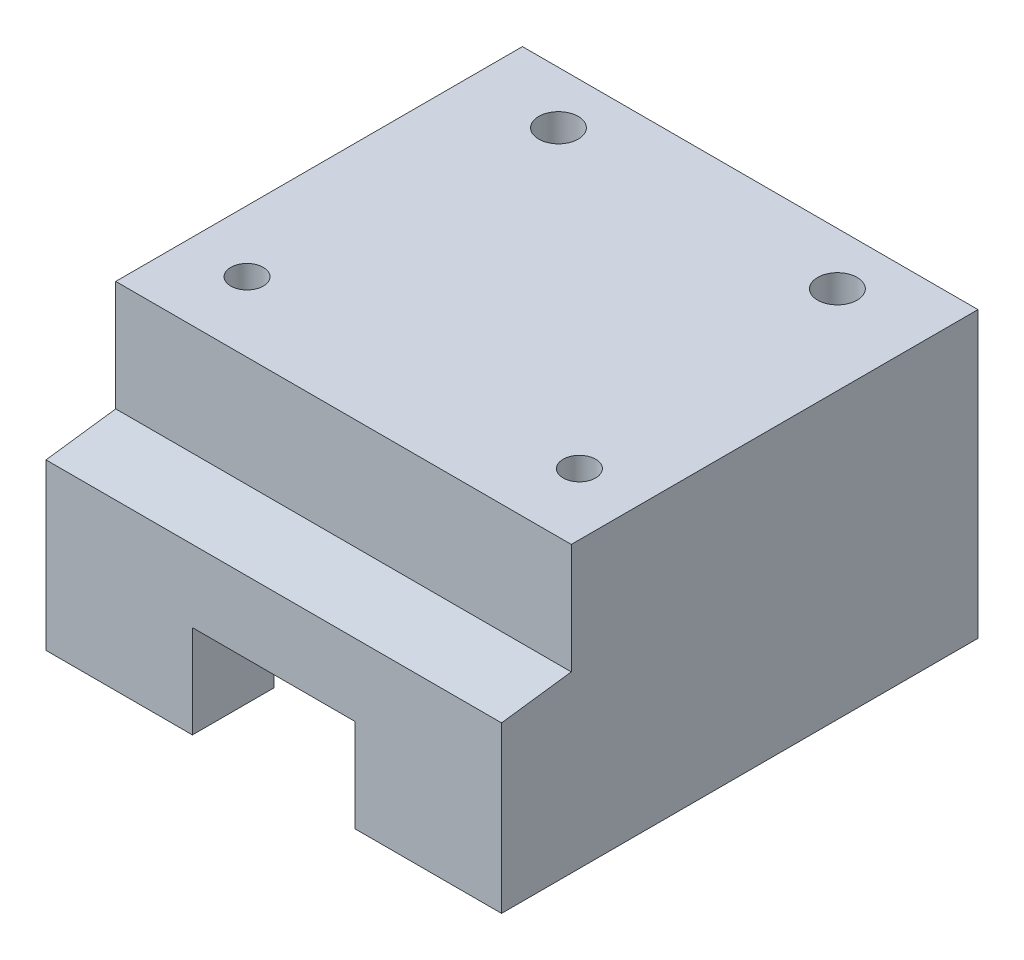
ISO-10303-21;
HEADER;
FILE_DESCRIPTION(('STEP AP214'),'2;1');
FILE_NAME('part.step','',(''),(''),'','','');
FILE_SCHEMA(('AUTOMOTIVE_DESIGN { 1 0 10303 214 1 1 1 1 }'));
ENDSEC;
DATA;
#1=APPLICATION_CONTEXT('core data for automotive mechanical design processes');
#2=APPLICATION_PROTOCOL_DEFINITION('international standard','automotive_design',2000,#1);
#3=PRODUCT_CONTEXT('',#1,'mechanical');
#4=PRODUCT('Part','Part','',(#3));
#5=PRODUCT_RELATED_PRODUCT_CATEGORY('part','',(#4));
#6=PRODUCT_DEFINITION_FORMATION('','',#4);
#7=PRODUCT_DEFINITION_CONTEXT('part definition',#1,'design');
#8=PRODUCT_DEFINITION('design','',#6,#7);
#9=PRODUCT_DEFINITION_SHAPE('','',#8);
#10=(LENGTH_UNIT() NAMED_UNIT(*) SI_UNIT(.MILLI.,.METRE.));
#11=(NAMED_UNIT(*) PLANE_ANGLE_UNIT() SI_UNIT($,.RADIAN.));
#12=(NAMED_UNIT(*) SI_UNIT($,.STERADIAN.) SOLID_ANGLE_UNIT());
#13=UNCERTAINTY_MEASURE_WITH_UNIT(LENGTH_MEASURE(1.E-05),#10,'distance_accuracy_value','');
#14=(GEOMETRIC_REPRESENTATION_CONTEXT(3) GLOBAL_UNCERTAINTY_ASSIGNED_CONTEXT((#13)) GLOBAL_UNIT_ASSIGNED_CONTEXT((#10,
#11,#12)) REPRESENTATION_CONTEXT('',''));
#15=CARTESIAN_POINT('',(0.,0.,0.));
#16=DIRECTION('',(0.,0.,1.));
#17=DIRECTION('',(1.,0.,0.));
#18=AXIS2_PLACEMENT_3D('',#15,#16,#17);
#19=CARTESIAN_POINT('',(0.,3.,0.));
#20=DIRECTION('',(0.,1.,0.));
#21=DIRECTION('',(-1.,0.,0.));
#22=AXIS2_PLACEMENT_3D('',#19,#20,#21);
#23=PLANE('',#22);
#24=DIRECTION('',(0.,0.,-1.));
#25=VECTOR('',#24,1.);
#26=CARTESIAN_POINT('',(-7.,3.,6.));
#27=LINE('',#26,#25);
#28=CARTESIAN_POINT('',(-7.,3.,6.));
#29=VERTEX_POINT('',#28);
#30=CARTESIAN_POINT('',(-7.,3.,-0.999999999999999));
#31=VERTEX_POINT('',#30);
#32=EDGE_CURVE('E306',#29,#31,#27,.T.);
#33=ORIENTED_EDGE('',*,*,#32,.T.);
#34=DIRECTION('',(1.,0.,0.));
#35=VECTOR('',#34,1.);
#36=CARTESIAN_POINT('',(0.,3.,-0.999999999999998));
#37=LINE('',#36,#35);
#38=CARTESIAN_POINT('',(7.,3.,-0.999999999999997));
#39=VERTEX_POINT('',#38);
#40=EDGE_CURVE('E372',#31,#39,#37,.T.);
#41=ORIENTED_EDGE('',*,*,#40,.T.);
#42=DIRECTION('',(0.,0.,1.));
#43=VECTOR('',#42,1.);
#44=CARTESIAN_POINT('',(7.00000000000001,3.,6.));
#45=LINE('',#44,#43);
#46=CARTESIAN_POINT('',(7.00000000000001,3.,6.));
#47=VERTEX_POINT('',#46);
#48=EDGE_CURVE('E317',#39,#47,#45,.T.);
#49=ORIENTED_EDGE('',*,*,#48,.T.);
#50=DIRECTION('',(-1.,0.,0.));
#51=VECTOR('',#50,1.);
#52=CARTESIAN_POINT('',(-7.,3.,6.));
#53=LINE('',#52,#51);
#54=EDGE_CURVE('E303',#47,#29,#53,.T.);
#55=ORIENTED_EDGE('',*,*,#54,.T.);
#56=EDGE_LOOP('',(#33,#41,#49,#55));
#57=FACE_BOUND('',#56,.T.);
#58=ADVANCED_FACE('F35',(#57),#23,.F.);
#59=CARTESIAN_POINT('',(0.,0.,6.));
#60=DIRECTION('',(0.,0.,1.));
#61=DIRECTION('',(1.,0.,0.));
#62=AXIS2_PLACEMENT_3D('',#59,#60,#61);
#63=PLANE('',#62);
#64=DIRECTION('',(0.,1.,0.));
#65=VECTOR('',#64,1.);
#66=CARTESIAN_POINT('',(19.6,-46.0019511730844,6.));
#67=LINE('',#66,#65);
#68=CARTESIAN_POINT('',(19.6,-5.,6.));
#69=VERTEX_POINT('',#68);
#70=CARTESIAN_POINT('',(19.6,9.2,6.));
#71=VERTEX_POINT('',#70);
#72=EDGE_CURVE('E193',#69,#71,#67,.T.);
#73=ORIENTED_EDGE('',*,*,#72,.T.);
#74=DIRECTION('',(-1.,0.,0.));
#75=VECTOR('',#74,1.);
#76=CARTESIAN_POINT('',(-20.,9.2,6.));
#77=LINE('',#76,#75);
#78=CARTESIAN_POINT('',(-19.6,9.2,6.));
#79=VERTEX_POINT('',#78);
#80=EDGE_CURVE('E57',#71,#79,#77,.T.);
#81=ORIENTED_EDGE('',*,*,#80,.T.);
#82=DIRECTION('',(0.,1.,0.));
#83=VECTOR('',#82,1.);
#84=CARTESIAN_POINT('',(-19.6,-46.0019511730844,6.));
#85=LINE('',#84,#83);
#86=CARTESIAN_POINT('',(-19.6,-5.,6.));
#87=VERTEX_POINT('',#86);
#88=EDGE_CURVE('E382',#87,#79,#85,.T.);
#89=ORIENTED_EDGE('',*,*,#88,.F.);
#90=DIRECTION('',(-1.,0.,0.));
#91=VECTOR('',#90,1.);
#92=CARTESIAN_POINT('',(-20.,-5.,6.));
#93=LINE('',#92,#91);
#94=CARTESIAN_POINT('',(-7.,-5.,6.));
#95=VERTEX_POINT('',#94);
#96=EDGE_CURVE('E241',#95,#87,#93,.T.);
#97=ORIENTED_EDGE('',*,*,#96,.F.);
#98=DIRECTION('',(0.,-1.,0.));
#99=VECTOR('',#98,1.);
#100=CARTESIAN_POINT('',(-7.,3.,6.));
#101=LINE('',#100,#99);
#102=EDGE_CURVE('E320',#29,#95,#101,.T.);
#103=ORIENTED_EDGE('',*,*,#102,.F.);
#104=ORIENTED_EDGE('',*,*,#54,.F.);
#105=DIRECTION('',(0.,-1.,0.));
#106=VECTOR('',#105,1.);
#107=CARTESIAN_POINT('',(7.00000000000001,3.,6.));
#108=LINE('',#107,#106);
#109=CARTESIAN_POINT('',(7.00000000000001,-5.,6.));
#110=VERTEX_POINT('',#109);
#111=EDGE_CURVE('E321',#47,#110,#108,.T.);
#112=ORIENTED_EDGE('',*,*,#111,.T.);
#113=EDGE_CURVE('E242',#69,#110,#93,.T.);
#114=ORIENTED_EDGE('',*,*,#113,.F.);
#115=EDGE_LOOP('',(#73,#81,#89,#97,#103,#104,#112,#114));
#116=FACE_BOUND('',#115,.T.);
#117=ADVANCED_FACE('F397',(#116),#63,.T.);
#118=CARTESIAN_POINT('',(0.,0.,0.));
#119=DIRECTION('',(0.,0.,1.));
#120=DIRECTION('',(1.,0.,0.));
#121=AXIS2_PLACEMENT_3D('',#118,#119,#120);
#122=PLANE('',#121);
#123=DIRECTION('',(0.,-1.,0.));
#124=VECTOR('',#123,1.);
#125=CARTESIAN_POINT('',(19.6,0.,0.));
#126=LINE('',#125,#124);
#127=CARTESIAN_POINT('',(19.6,19.5,0.));
#128=VERTEX_POINT('',#127);
#129=CARTESIAN_POINT('',(19.6,10.,0.));
#130=VERTEX_POINT('',#129);
#131=EDGE_CURVE('E49',#128,#130,#126,.T.);
#132=ORIENTED_EDGE('',*,*,#131,.F.);
#133=DIRECTION('',(1.,0.,0.));
#134=VECTOR('',#133,1.);
#135=CARTESIAN_POINT('',(-20.,19.5,0.));
#136=LINE('',#135,#134);
#137=CARTESIAN_POINT('',(-19.6,19.5,0.));
#138=VERTEX_POINT('',#137);
#139=EDGE_CURVE('E203',#138,#128,#136,.T.);
#140=ORIENTED_EDGE('',*,*,#139,.F.);
#141=DIRECTION('',(0.,1.,0.));
#142=VECTOR('',#141,1.);
#143=CARTESIAN_POINT('',(-19.6,0.,0.));
#144=LINE('',#143,#142);
#145=CARTESIAN_POINT('',(-19.6,9.99999999999998,0.));
#146=VERTEX_POINT('',#145);
#147=EDGE_CURVE('E214',#146,#138,#144,.T.);
#148=ORIENTED_EDGE('',*,*,#147,.F.);
#149=DIRECTION('',(-1.,0.,0.));
#150=VECTOR('',#149,1.);
#151=CARTESIAN_POINT('',(20.,10.,0.));
#152=LINE('',#151,#150);
#153=EDGE_CURVE('E324',#130,#146,#152,.T.);
#154=ORIENTED_EDGE('',*,*,#153,.F.);
#155=EDGE_LOOP('',(#132,#140,#148,#154));
#156=FACE_BOUND('',#155,.T.);
#157=ADVANCED_FACE('F386',(#156),#122,.T.);
#158=CARTESIAN_POINT('',(0.,0.,-35.));
#159=DIRECTION('',(0.,0.,1.));
#160=DIRECTION('',(1.,0.,0.));
#161=AXIS2_PLACEMENT_3D('',#158,#159,#160);
#162=PLANE('',#161);
#163=DIRECTION('',(-1.,0.,0.));
#164=VECTOR('',#163,1.);
#165=CARTESIAN_POINT('',(-20.,19.5,-35.));
#166=LINE('',#165,#164);
#167=CARTESIAN_POINT('',(19.6,19.5,-35.));
#168=VERTEX_POINT('',#167);
#169=CARTESIAN_POINT('',(-19.6,19.5,-35.));
#170=VERTEX_POINT('',#169);
#171=EDGE_CURVE('E200',#168,#170,#166,.T.);
#172=ORIENTED_EDGE('',*,*,#171,.F.);
#173=DIRECTION('',(0.,1.,0.));
#174=VECTOR('',#173,1.);
#175=CARTESIAN_POINT('',(19.6,-46.0019511730844,-35.));
#176=LINE('',#175,#174);
#177=CARTESIAN_POINT('',(19.6,-5.,-35.));
#178=VERTEX_POINT('',#177);
#179=EDGE_CURVE('E183',#178,#168,#176,.T.);
#180=ORIENTED_EDGE('',*,*,#179,.F.);
#181=DIRECTION('',(1.,0.,0.));
#182=VECTOR('',#181,1.);
#183=CARTESIAN_POINT('',(-20.,-5.,-35.));
#184=LINE('',#183,#182);
#185=CARTESIAN_POINT('',(3.50000000000001,-5.,-35.));
#186=VERTEX_POINT('',#185);
#187=EDGE_CURVE('E238',#186,#178,#184,.T.);
#188=ORIENTED_EDGE('',*,*,#187,.F.);
#189=DIRECTION('',(0.,-1.,0.));
#190=VECTOR('',#189,1.);
#191=CARTESIAN_POINT('',(3.50000000000001,3.,-35.));
#192=LINE('',#191,#190);
#193=CARTESIAN_POINT('',(3.50000000000001,3.,-35.));
#194=VERTEX_POINT('',#193);
#195=EDGE_CURVE('E343',#194,#186,#192,.T.);
#196=ORIENTED_EDGE('',*,*,#195,.F.);
#197=DIRECTION('',(1.,0.,0.));
#198=VECTOR('',#197,1.);
#199=CARTESIAN_POINT('',(3.50000000000001,3.,-35.));
#200=LINE('',#199,#198);
#201=CARTESIAN_POINT('',(-3.5,3.,-35.));
#202=VERTEX_POINT('',#201);
#203=EDGE_CURVE('E311',#202,#194,#200,.T.);
#204=ORIENTED_EDGE('',*,*,#203,.F.);
#205=DIRECTION('',(0.,-1.,0.));
#206=VECTOR('',#205,1.);
#207=CARTESIAN_POINT('',(-3.5,3.,-35.));
#208=LINE('',#207,#206);
#209=CARTESIAN_POINT('',(-3.5,-5.,-35.));
#210=VERTEX_POINT('',#209);
#211=EDGE_CURVE('E346',#202,#210,#208,.T.);
#212=ORIENTED_EDGE('',*,*,#211,.T.);
#213=CARTESIAN_POINT('',(-19.6,-5.,-35.));
#214=VERTEX_POINT('',#213);
#215=EDGE_CURVE('E239',#214,#210,#184,.T.);
#216=ORIENTED_EDGE('',*,*,#215,.F.);
#217=DIRECTION('',(0.,1.,0.));
#218=VECTOR('',#217,1.);
#219=CARTESIAN_POINT('',(-19.6,-46.0019511730844,-35.));
#220=LINE('',#219,#218);
#221=EDGE_CURVE('E208',#214,#170,#220,.T.);
#222=ORIENTED_EDGE('',*,*,#221,.T.);
#223=EDGE_LOOP('',(#172,#180,#188,#196,#204,#212,#216,#222));
#224=FACE_BOUND('',#223,.T.);
#225=ADVANCED_FACE('F206',(#224),#162,.F.);
#226=CARTESIAN_POINT('',(7.00000000000001,3.,6.));
#227=DIRECTION('',(1.,0.,0.));
#228=DIRECTION('',(0.,0.,-1.));
#229=AXIS2_PLACEMENT_3D('',#226,#227,#228);
#230=PLANE('',#229);
#231=DIRECTION('',(0.,-1.,0.));
#232=VECTOR('',#231,1.);
#233=CARTESIAN_POINT('',(7.,3.,-0.999999999999997));
#234=LINE('',#233,#232);
#235=CARTESIAN_POINT('',(7.,-5.,-0.999999999999997));
#236=VERTEX_POINT('',#235);
#237=EDGE_CURVE('E325',#39,#236,#234,.T.);
#238=ORIENTED_EDGE('',*,*,#237,.T.);
#239=DIRECTION('',(0.,0.,1.));
#240=VECTOR('',#239,1.);
#241=CARTESIAN_POINT('',(7.00000000000001,-5.,6.));
#242=LINE('',#241,#240);
#243=EDGE_CURVE('E276',#236,#110,#242,.T.);
#244=ORIENTED_EDGE('',*,*,#243,.T.);
#245=ORIENTED_EDGE('',*,*,#111,.F.);
#246=ORIENTED_EDGE('',*,*,#48,.F.);
#247=EDGE_LOOP('',(#238,#244,#245,#246));
#248=FACE_BOUND('',#247,.T.);
#249=ADVANCED_FACE('F473',(#248),#230,.F.);
#250=CARTESIAN_POINT('',(7.,3.,-0.999999999999997));
#251=DIRECTION('',(0.,0.,1.));
#252=DIRECTION('',(1.,0.,0.));
#253=AXIS2_PLACEMENT_3D('',#250,#251,#252);
#254=PLANE('',#253);
#255=DIRECTION('',(0.,-1.,0.));
#256=VECTOR('',#255,1.);
#257=CARTESIAN_POINT('',(8.6,3.,-0.999999999999997));
#258=LINE('',#257,#256);
#259=CARTESIAN_POINT('',(8.6,5.,-0.999999999999997));
#260=VERTEX_POINT('',#259);
#261=CARTESIAN_POINT('',(8.6,-5.,-0.999999999999997));
#262=VERTEX_POINT('',#261);
#263=EDGE_CURVE('E328',#260,#262,#258,.T.);
#264=ORIENTED_EDGE('',*,*,#263,.T.);
#265=DIRECTION('',(-1.,0.,0.));
#266=VECTOR('',#265,1.);
#267=CARTESIAN_POINT('',(7.,-5.,-0.999999999999997));
#268=LINE('',#267,#266);
#269=EDGE_CURVE('E248',#262,#236,#268,.T.);
#270=ORIENTED_EDGE('',*,*,#269,.T.);
#271=ORIENTED_EDGE('',*,*,#237,.F.);
#272=ORIENTED_EDGE('',*,*,#40,.F.);
#273=DIRECTION('',(0.,-1.,0.));
#274=VECTOR('',#273,1.);
#275=CARTESIAN_POINT('',(-7.,3.,-0.999999999999999));
#276=LINE('',#275,#274);
#277=CARTESIAN_POINT('',(-7.,-5.,-0.999999999999999));
#278=VERTEX_POINT('',#277);
#279=EDGE_CURVE('E364',#31,#278,#276,.T.);
#280=ORIENTED_EDGE('',*,*,#279,.T.);
#281=CARTESIAN_POINT('',(-8.6,-5.,-1.));
#282=VERTEX_POINT('',#281);
#283=EDGE_CURVE('E244',#278,#282,#268,.T.);
#284=ORIENTED_EDGE('',*,*,#283,.T.);
#285=DIRECTION('',(0.,-1.,0.));
#286=VECTOR('',#285,1.);
#287=CARTESIAN_POINT('',(-8.6,3.,-0.999999999999999));
#288=LINE('',#287,#286);
#289=CARTESIAN_POINT('',(-8.6,5.,-0.999999999999999));
#290=VERTEX_POINT('',#289);
#291=EDGE_CURVE('E361',#290,#282,#288,.T.);
#292=ORIENTED_EDGE('',*,*,#291,.F.);
#293=DIRECTION('',(-1.,0.,0.));
#294=VECTOR('',#293,1.);
#295=CARTESIAN_POINT('',(-8.6,5.,-0.999999999999999));
#296=LINE('',#295,#294);
#297=EDGE_CURVE('E300',#260,#290,#296,.T.);
#298=ORIENTED_EDGE('',*,*,#297,.F.);
#299=EDGE_LOOP('',(#264,#270,#271,#272,#280,#284,#292,#298));
#300=FACE_BOUND('',#299,.T.);
#301=ADVANCED_FACE('F463',(#300),#254,.F.);
#302=CARTESIAN_POINT('',(8.6,3.,-0.999999999999997));
#303=DIRECTION('',(1.,0.,0.));
#304=DIRECTION('',(0.,0.,-1.));
#305=AXIS2_PLACEMENT_3D('',#302,#303,#304);
#306=PLANE('',#305);
#307=DIRECTION('',(0.,-1.,0.));
#308=VECTOR('',#307,1.);
#309=CARTESIAN_POINT('',(8.6,3.,-18.5));
#310=LINE('',#309,#308);
#311=CARTESIAN_POINT('',(8.6,5.,-18.5));
#312=VERTEX_POINT('',#311);
#313=CARTESIAN_POINT('',(8.6,-5.,-18.5));
#314=VERTEX_POINT('',#313);
#315=EDGE_CURVE('E331',#312,#314,#310,.T.);
#316=ORIENTED_EDGE('',*,*,#315,.T.);
#317=DIRECTION('',(0.,0.,1.));
#318=VECTOR('',#317,1.);
#319=CARTESIAN_POINT('',(8.6,-5.,-0.999999999999997));
#320=LINE('',#319,#318);
#321=EDGE_CURVE('E273',#314,#262,#320,.T.);
#322=ORIENTED_EDGE('',*,*,#321,.T.);
#323=ORIENTED_EDGE('',*,*,#263,.F.);
#324=DIRECTION('',(0.,0.,1.));
#325=VECTOR('',#324,1.);
#326=CARTESIAN_POINT('',(8.6,5.,-0.999999999999997));
#327=LINE('',#326,#325);
#328=EDGE_CURVE('E297',#312,#260,#327,.T.);
#329=ORIENTED_EDGE('',*,*,#328,.F.);
#330=EDGE_LOOP('',(#316,#322,#323,#329));
#331=FACE_BOUND('',#330,.T.);
#332=ADVANCED_FACE('F476',(#331),#306,.F.);
#333=CARTESIAN_POINT('',(8.6,3.,-18.5));
#334=DIRECTION('',(0.946291022800121,0.,-0.323316099456708));
#335=DIRECTION('',(-0.323316099456708,0.,-0.946291022800122));
#336=AXIS2_PLACEMENT_3D('',#333,#334,#335);
#337=PLANE('',#336);
#338=DIRECTION('',(0.,-1.,0.));
#339=VECTOR('',#338,1.);
#340=CARTESIAN_POINT('',(4.5,3.,-30.5));
#341=LINE('',#340,#339);
#342=CARTESIAN_POINT('',(4.5,5.,-30.5));
#343=VERTEX_POINT('',#342);
#344=CARTESIAN_POINT('',(4.5,-5.,-30.5));
#345=VERTEX_POINT('',#344);
#346=EDGE_CURVE('E334',#343,#345,#341,.T.);
#347=ORIENTED_EDGE('',*,*,#346,.T.);
#348=DIRECTION('',(0.323316099456708,0.,0.946291022800122));
#349=VECTOR('',#348,1.);
#350=CARTESIAN_POINT('',(8.6,-5.,-18.5));
#351=LINE('',#350,#349);
#352=EDGE_CURVE('E270',#345,#314,#351,.T.);
#353=ORIENTED_EDGE('',*,*,#352,.T.);
#354=ORIENTED_EDGE('',*,*,#315,.F.);
#355=DIRECTION('',(0.323316099456708,0.,0.946291022800121));
#356=VECTOR('',#355,1.);
#357=CARTESIAN_POINT('',(8.6,5.,-18.5));
#358=LINE('',#357,#356);
#359=EDGE_CURVE('E294',#343,#312,#358,.T.);
#360=ORIENTED_EDGE('',*,*,#359,.F.);
#361=EDGE_LOOP('',(#347,#353,#354,#360));
#362=FACE_BOUND('',#361,.T.);
#363=ADVANCED_FACE('F449',(#362),#337,.F.);
#364=CARTESIAN_POINT('',(4.5,3.,-30.5));
#365=DIRECTION('',(1.,0.,0.));
#366=DIRECTION('',(0.,0.,-1.));
#367=AXIS2_PLACEMENT_3D('',#364,#365,#366);
#368=PLANE('',#367);
#369=DIRECTION('',(0.,-1.,0.));
#370=VECTOR('',#369,1.);
#371=CARTESIAN_POINT('',(4.5,3.,-34.));
#372=LINE('',#371,#370);
#373=CARTESIAN_POINT('',(4.5,5.,-34.));
#374=VERTEX_POINT('',#373);
#375=CARTESIAN_POINT('',(4.50000000000001,-5.,-34.));
#376=VERTEX_POINT('',#375);
#377=EDGE_CURVE('E337',#374,#376,#372,.T.);
#378=ORIENTED_EDGE('',*,*,#377,.T.);
#379=DIRECTION('',(0.,0.,1.));
#380=VECTOR('',#379,1.);
#381=CARTESIAN_POINT('',(4.5,-5.,-30.5));
#382=LINE('',#381,#380);
#383=EDGE_CURVE('E267',#376,#345,#382,.T.);
#384=ORIENTED_EDGE('',*,*,#383,.T.);
#385=ORIENTED_EDGE('',*,*,#346,.F.);
#386=DIRECTION('',(0.,0.,1.));
#387=VECTOR('',#386,1.);
#388=CARTESIAN_POINT('',(4.5,5.,-30.5));
#389=LINE('',#388,#387);
#390=EDGE_CURVE('E291',#374,#343,#389,.T.);
#391=ORIENTED_EDGE('',*,*,#390,.F.);
#392=EDGE_LOOP('',(#378,#384,#385,#391));
#393=FACE_BOUND('',#392,.T.);
#394=ADVANCED_FACE('F445',(#393),#368,.F.);
#395=CARTESIAN_POINT('',(4.5,3.,-34.));
#396=DIRECTION('',(0.,0.,-1.));
#397=DIRECTION('',(-1.,0.,0.));
#398=AXIS2_PLACEMENT_3D('',#395,#396,#397);
#399=PLANE('',#398);
#400=DIRECTION('',(0.,-1.,0.));
#401=VECTOR('',#400,1.);
#402=CARTESIAN_POINT('',(-4.5,3.,-34.));
#403=LINE('',#402,#401);
#404=CARTESIAN_POINT('',(-4.5,5.,-34.));
#405=VERTEX_POINT('',#404);
#406=CARTESIAN_POINT('',(-4.49999999999999,-5.,-34.));
#407=VERTEX_POINT('',#406);
#408=EDGE_CURVE('E352',#405,#407,#403,.T.);
#409=ORIENTED_EDGE('',*,*,#408,.T.);
#410=DIRECTION('',(1.,0.,0.));
#411=VECTOR('',#410,1.);
#412=CARTESIAN_POINT('',(4.50000000000001,-5.,-34.));
#413=LINE('',#412,#411);
#414=CARTESIAN_POINT('',(-3.49999999999999,-5.,-34.));
#415=VERTEX_POINT('',#414);
#416=EDGE_CURVE('E257',#407,#415,#413,.T.);
#417=ORIENTED_EDGE('',*,*,#416,.T.);
#418=DIRECTION('',(0.,-1.,0.));
#419=VECTOR('',#418,1.);
#420=CARTESIAN_POINT('',(-3.5,3.,-34.));
#421=LINE('',#420,#419);
#422=CARTESIAN_POINT('',(-3.5,3.,-34.));
#423=VERTEX_POINT('',#422);
#424=EDGE_CURVE('E349',#423,#415,#421,.T.);
#425=ORIENTED_EDGE('',*,*,#424,.F.);
#426=DIRECTION('',(-1.,0.,0.));
#427=VECTOR('',#426,1.);
#428=CARTESIAN_POINT('',(0.,3.,-34.));
#429=LINE('',#428,#427);
#430=CARTESIAN_POINT('',(3.5,3.,-34.));
#431=VERTEX_POINT('',#430);
#432=EDGE_CURVE('E370',#431,#423,#429,.T.);
#433=ORIENTED_EDGE('',*,*,#432,.F.);
#434=DIRECTION('',(0.,-1.,0.));
#435=VECTOR('',#434,1.);
#436=CARTESIAN_POINT('',(3.5,3.,-34.));
#437=LINE('',#436,#435);
#438=CARTESIAN_POINT('',(3.50000000000001,-5.,-34.));
#439=VERTEX_POINT('',#438);
#440=EDGE_CURVE('E340',#431,#439,#437,.T.);
#441=ORIENTED_EDGE('',*,*,#440,.T.);
#442=EDGE_CURVE('E261',#439,#376,#413,.T.);
#443=ORIENTED_EDGE('',*,*,#442,.T.);
#444=ORIENTED_EDGE('',*,*,#377,.F.);
#445=DIRECTION('',(1.,0.,0.));
#446=VECTOR('',#445,1.);
#447=CARTESIAN_POINT('',(4.5,5.,-34.));
#448=LINE('',#447,#446);
#449=EDGE_CURVE('E288',#405,#374,#448,.T.);
#450=ORIENTED_EDGE('',*,*,#449,.F.);
#451=EDGE_LOOP('',(#409,#417,#425,#433,#441,#443,#444,#450));
#452=FACE_BOUND('',#451,.T.);
#453=ADVANCED_FACE('F437',(#452),#399,.F.);
#454=CARTESIAN_POINT('',(3.5,3.,-34.));
#455=DIRECTION('',(1.,0.,0.));
#456=DIRECTION('',(0.,0.,-1.));
#457=AXIS2_PLACEMENT_3D('',#454,#455,#456);
#458=PLANE('',#457);
#459=ORIENTED_EDGE('',*,*,#195,.T.);
#460=DIRECTION('',(0.,0.,1.));
#461=VECTOR('',#460,1.);
#462=CARTESIAN_POINT('',(3.50000000000001,-5.,-34.));
#463=LINE('',#462,#461);
#464=EDGE_CURVE('E264',#186,#439,#463,.T.);
#465=ORIENTED_EDGE('',*,*,#464,.T.);
#466=ORIENTED_EDGE('',*,*,#440,.F.);
#467=DIRECTION('',(0.,0.,1.));
#468=VECTOR('',#467,1.);
#469=CARTESIAN_POINT('',(3.5,3.,-34.));
#470=LINE('',#469,#468);
#471=EDGE_CURVE('E314',#194,#431,#470,.T.);
#472=ORIENTED_EDGE('',*,*,#471,.F.);
#473=EDGE_LOOP('',(#459,#465,#466,#472));
#474=FACE_BOUND('',#473,.T.);
#475=ADVANCED_FACE('F434',(#474),#458,.F.);
#476=CARTESIAN_POINT('',(-3.5,3.,-34.));
#477=DIRECTION('',(-1.,0.,0.));
#478=DIRECTION('',(0.,-1.,0.));
#479=AXIS2_PLACEMENT_3D('',#476,#477,#478);
#480=PLANE('',#479);
#481=ORIENTED_EDGE('',*,*,#424,.T.);
#482=DIRECTION('',(0.,0.,-1.));
#483=VECTOR('',#482,1.);
#484=CARTESIAN_POINT('',(-3.49999999999999,-5.,-34.));
#485=LINE('',#484,#483);
#486=EDGE_CURVE('E260',#415,#210,#485,.T.);
#487=ORIENTED_EDGE('',*,*,#486,.T.);
#488=ORIENTED_EDGE('',*,*,#211,.F.);
#489=DIRECTION('',(0.,0.,-1.));
#490=VECTOR('',#489,1.);
#491=CARTESIAN_POINT('',(-3.5,3.,-34.));
#492=LINE('',#491,#490);
#493=EDGE_CURVE('E309',#423,#202,#492,.T.);
#494=ORIENTED_EDGE('',*,*,#493,.F.);
#495=EDGE_LOOP('',(#481,#487,#488,#494));
#496=FACE_BOUND('',#495,.T.);
#497=ADVANCED_FACE('F441',(#496),#480,.F.);
#498=CARTESIAN_POINT('',(-4.5,3.,-30.5));
#499=DIRECTION('',(-1.,0.,0.));
#500=DIRECTION('',(0.,-1.,0.));
#501=AXIS2_PLACEMENT_3D('',#498,#499,#500);
#502=PLANE('',#501);
#503=DIRECTION('',(0.,-1.,0.));
#504=VECTOR('',#503,1.);
#505=CARTESIAN_POINT('',(-4.5,3.,-30.5));
#506=LINE('',#505,#504);
#507=CARTESIAN_POINT('',(-4.5,5.,-30.5));
#508=VERTEX_POINT('',#507);
#509=CARTESIAN_POINT('',(-4.49999999999999,-5.,-30.5));
#510=VERTEX_POINT('',#509);
#511=EDGE_CURVE('E355',#508,#510,#506,.T.);
#512=ORIENTED_EDGE('',*,*,#511,.T.);
#513=DIRECTION('',(0.,0.,-1.));
#514=VECTOR('',#513,1.);
#515=CARTESIAN_POINT('',(-4.49999999999999,-5.,-30.5));
#516=LINE('',#515,#514);
#517=EDGE_CURVE('E254',#510,#407,#516,.T.);
#518=ORIENTED_EDGE('',*,*,#517,.T.);
#519=ORIENTED_EDGE('',*,*,#408,.F.);
#520=DIRECTION('',(0.,0.,-1.));
#521=VECTOR('',#520,1.);
#522=CARTESIAN_POINT('',(-4.5,5.,-34.));
#523=LINE('',#522,#521);
#524=EDGE_CURVE('E285',#508,#405,#523,.T.);
#525=ORIENTED_EDGE('',*,*,#524,.F.);
#526=EDGE_LOOP('',(#512,#518,#519,#525));
#527=FACE_BOUND('',#526,.T.);
#528=ADVANCED_FACE('F454',(#527),#502,.F.);
#529=CARTESIAN_POINT('',(-8.6,3.,-18.5));
#530=DIRECTION('',(-0.946291022800121,0.,-0.323316099456708));
#531=DIRECTION('',(-0.323316099456708,0.,0.946291022800121));
#532=AXIS2_PLACEMENT_3D('',#529,#530,#531);
#533=PLANE('',#532);
#534=DIRECTION('',(0.,-1.,0.));
#535=VECTOR('',#534,1.);
#536=CARTESIAN_POINT('',(-8.6,3.,-18.5));
#537=LINE('',#536,#535);
#538=CARTESIAN_POINT('',(-8.6,5.,-18.5));
#539=VERTEX_POINT('',#538);
#540=CARTESIAN_POINT('',(-8.59999999999999,-5.,-18.5));
#541=VERTEX_POINT('',#540);
#542=EDGE_CURVE('E358',#539,#541,#537,.T.);
#543=ORIENTED_EDGE('',*,*,#542,.T.);
#544=DIRECTION('',(0.323316099456708,0.,-0.946291022800121));
#545=VECTOR('',#544,1.);
#546=CARTESIAN_POINT('',(-8.59999999999999,-5.,-18.5));
#547=LINE('',#546,#545);
#548=EDGE_CURVE('E251',#541,#510,#547,.T.);
#549=ORIENTED_EDGE('',*,*,#548,.T.);
#550=ORIENTED_EDGE('',*,*,#511,.F.);
#551=DIRECTION('',(0.323316099456708,0.,-0.946291022800122));
#552=VECTOR('',#551,1.);
#553=CARTESIAN_POINT('',(-4.5,5.,-30.5));
#554=LINE('',#553,#552);
#555=EDGE_CURVE('E282',#539,#508,#554,.T.);
#556=ORIENTED_EDGE('',*,*,#555,.F.);
#557=EDGE_LOOP('',(#543,#549,#550,#556));
#558=FACE_BOUND('',#557,.T.);
#559=ADVANCED_FACE('F458',(#558),#533,.F.);
#560=CARTESIAN_POINT('',(-8.6,3.,-0.999999999999999));
#561=DIRECTION('',(-1.,0.,0.));
#562=DIRECTION('',(0.,-1.,0.));
#563=AXIS2_PLACEMENT_3D('',#560,#561,#562);
#564=PLANE('',#563);
#565=ORIENTED_EDGE('',*,*,#291,.T.);
#566=DIRECTION('',(0.,0.,-1.));
#567=VECTOR('',#566,1.);
#568=CARTESIAN_POINT('',(-8.6,-5.,-0.999999999999999));
#569=LINE('',#568,#567);
#570=EDGE_CURVE('E247',#282,#541,#569,.T.);
#571=ORIENTED_EDGE('',*,*,#570,.T.);
#572=ORIENTED_EDGE('',*,*,#542,.F.);
#573=DIRECTION('',(0.,0.,-1.));
#574=VECTOR('',#573,1.);
#575=CARTESIAN_POINT('',(-8.6,5.,-18.5));
#576=LINE('',#575,#574);
#577=EDGE_CURVE('E279',#290,#539,#576,.T.);
#578=ORIENTED_EDGE('',*,*,#577,.F.);
#579=EDGE_LOOP('',(#565,#571,#572,#578));
#580=FACE_BOUND('',#579,.T.);
#581=ADVANCED_FACE('F426',(#580),#564,.F.);
#582=CARTESIAN_POINT('',(-7.,3.,6.));
#583=DIRECTION('',(-1.,0.,0.));
#584=DIRECTION('',(0.,-1.,0.));
#585=AXIS2_PLACEMENT_3D('',#582,#583,#584);
#586=PLANE('',#585);
#587=ORIENTED_EDGE('',*,*,#102,.T.);
#588=DIRECTION('',(0.,0.,-1.));
#589=VECTOR('',#588,1.);
#590=CARTESIAN_POINT('',(-7.,-5.,6.));
#591=LINE('',#590,#589);
#592=EDGE_CURVE('E374',#95,#278,#591,.T.);
#593=ORIENTED_EDGE('',*,*,#592,.T.);
#594=ORIENTED_EDGE('',*,*,#279,.F.);
#595=ORIENTED_EDGE('',*,*,#32,.F.);
#596=EDGE_LOOP('',(#587,#593,#594,#595));
#597=FACE_BOUND('',#596,.T.);
#598=ADVANCED_FACE('F418',(#597),#586,.F.);
#599=ORIENTED_EDGE('',*,*,#471,.T.);
#600=ORIENTED_EDGE('',*,*,#432,.T.);
#601=ORIENTED_EDGE('',*,*,#493,.T.);
#602=ORIENTED_EDGE('',*,*,#203,.T.);
#603=EDGE_LOOP('',(#599,#600,#601,#602));
#604=FACE_BOUND('',#603,.T.);
#605=ADVANCED_FACE('F410',(#604),#23,.F.);
#606=CARTESIAN_POINT('',(0.,5.,0.));
#607=DIRECTION('',(0.,1.,0.));
#608=DIRECTION('',(-1.,0.,0.));
#609=AXIS2_PLACEMENT_3D('',#606,#607,#608);
#610=PLANE('',#609);
#611=ORIENTED_EDGE('',*,*,#577,.T.);
#612=ORIENTED_EDGE('',*,*,#555,.T.);
#613=ORIENTED_EDGE('',*,*,#524,.T.);
#614=ORIENTED_EDGE('',*,*,#449,.T.);
#615=ORIENTED_EDGE('',*,*,#390,.T.);
#616=ORIENTED_EDGE('',*,*,#359,.T.);
#617=ORIENTED_EDGE('',*,*,#328,.T.);
#618=ORIENTED_EDGE('',*,*,#297,.T.);
#619=EDGE_LOOP('',(#611,#612,#613,#614,#615,#616,#617,#618));
#620=FACE_BOUND('',#619,.T.);
#621=ADVANCED_FACE('F417',(#620),#610,.F.);
#622=CARTESIAN_POINT('',(0.,-5.,0.));
#623=DIRECTION('',(0.,1.,0.));
#624=DIRECTION('',(-1.,0.,0.));
#625=AXIS2_PLACEMENT_3D('',#622,#623,#624);
#626=PLANE('',#625);
#627=CARTESIAN_POINT('',(-12.,-5.,-30.5));
#628=DIRECTION('',(0.,-1.,0.));
#629=DIRECTION('',(-1.,0.,0.));
#630=AXIS2_PLACEMENT_3D('',#627,#628,#629);
#631=CIRCLE('',#630,1.7);
#632=CARTESIAN_POINT('',(-13.7,-5.,-30.5));
#633=VERTEX_POINT('',#632);
#634=EDGE_CURVE('E231',#633,#633,#631,.T.);
#635=ORIENTED_EDGE('',*,*,#634,.F.);
#636=EDGE_LOOP('',(#635));
#637=FACE_BOUND('',#636,.T.);
#638=CARTESIAN_POINT('',(-14.3,-5.,-6.));
#639=DIRECTION('',(0.,-1.,0.));
#640=DIRECTION('',(-1.,0.,0.));
#641=AXIS2_PLACEMENT_3D('',#638,#639,#640);
#642=CIRCLE('',#641,1.4);
#643=CARTESIAN_POINT('',(-15.7,-5.,-6.));
#644=VERTEX_POINT('',#643);
#645=EDGE_CURVE('E226',#644,#644,#642,.T.);
#646=ORIENTED_EDGE('',*,*,#645,.F.);
#647=EDGE_LOOP('',(#646));
#648=FACE_BOUND('',#647,.T.);
#649=ORIENTED_EDGE('',*,*,#96,.T.);
#650=DIRECTION('',(0.,0.,1.));
#651=VECTOR('',#650,1.);
#652=CARTESIAN_POINT('',(-19.6,-5.,-35.));
#653=LINE('',#652,#651);
#654=EDGE_CURVE('E387',#214,#87,#653,.T.);
#655=ORIENTED_EDGE('',*,*,#654,.F.);
#656=ORIENTED_EDGE('',*,*,#215,.T.);
#657=ORIENTED_EDGE('',*,*,#486,.F.);
#658=ORIENTED_EDGE('',*,*,#416,.F.);
#659=ORIENTED_EDGE('',*,*,#517,.F.);
#660=ORIENTED_EDGE('',*,*,#548,.F.);
#661=ORIENTED_EDGE('',*,*,#570,.F.);
#662=ORIENTED_EDGE('',*,*,#283,.F.);
#663=ORIENTED_EDGE('',*,*,#592,.F.);
#664=EDGE_LOOP('',(#649,#655,#656,#657,#658,#659,#660,#661,#662,#663));
#665=FACE_BOUND('',#664,.T.);
#666=ADVANCED_FACE('F424',(#637,#648,#665),#626,.F.);
#667=CARTESIAN_POINT('',(14.3,-5.,-6.));
#668=DIRECTION('',(0.,-1.,0.));
#669=DIRECTION('',(1.,0.,0.));
#670=AXIS2_PLACEMENT_3D('',#667,#668,#669);
#671=CIRCLE('',#670,1.4);
#672=CARTESIAN_POINT('',(15.7,-5.,-6.));
#673=VERTEX_POINT('',#672);
#674=EDGE_CURVE('E227',#673,#673,#671,.T.);
#675=ORIENTED_EDGE('',*,*,#674,.F.);
#676=EDGE_LOOP('',(#675));
#677=FACE_BOUND('',#676,.T.);
#678=CARTESIAN_POINT('',(12.,-5.,-30.5));
#679=DIRECTION('',(0.,-1.,0.));
#680=DIRECTION('',(1.,0.,0.));
#681=AXIS2_PLACEMENT_3D('',#678,#679,#680);
#682=CIRCLE('',#681,1.7);
#683=CARTESIAN_POINT('',(13.7,-5.,-30.5));
#684=VERTEX_POINT('',#683);
#685=EDGE_CURVE('E230',#684,#684,#682,.T.);
#686=ORIENTED_EDGE('',*,*,#685,.F.);
#687=EDGE_LOOP('',(#686));
#688=FACE_BOUND('',#687,.T.);
#689=ORIENTED_EDGE('',*,*,#187,.T.);
#690=DIRECTION('',(0.,0.,-1.));
#691=VECTOR('',#690,1.);
#692=CARTESIAN_POINT('',(19.6,-5.,-35.));
#693=LINE('',#692,#691);
#694=EDGE_CURVE('E188',#69,#178,#693,.T.);
#695=ORIENTED_EDGE('',*,*,#694,.F.);
#696=ORIENTED_EDGE('',*,*,#113,.T.);
#697=ORIENTED_EDGE('',*,*,#243,.F.);
#698=ORIENTED_EDGE('',*,*,#269,.F.);
#699=ORIENTED_EDGE('',*,*,#321,.F.);
#700=ORIENTED_EDGE('',*,*,#352,.F.);
#701=ORIENTED_EDGE('',*,*,#383,.F.);
#702=ORIENTED_EDGE('',*,*,#442,.F.);
#703=ORIENTED_EDGE('',*,*,#464,.F.);
#704=EDGE_LOOP('',(#689,#695,#696,#697,#698,#699,#700,#701,#702,#703));
#705=FACE_BOUND('',#704,.T.);
#706=ADVANCED_FACE('F443',(#677,#688,#705),#626,.F.);
#707=CARTESIAN_POINT('',(12.,22.5,-30.5));
#708=DIRECTION('',(0.,-1.,0.));
#709=DIRECTION('',(1.,0.,0.));
#710=AXIS2_PLACEMENT_3D('',#707,#708,#709);
#711=CYLINDRICAL_SURFACE('',#710,1.7);
#712=CARTESIAN_POINT('',(12.,19.5,-30.5));
#713=DIRECTION('',(0.,-1.,0.));
#714=DIRECTION('',(0.,0.,-1.));
#715=AXIS2_PLACEMENT_3D('',#712,#713,#714);
#716=CIRCLE('',#715,1.7);
#717=CARTESIAN_POINT('',(12.,19.5,-32.2));
#718=VERTEX_POINT('',#717);
#719=EDGE_CURVE('E223',#718,#718,#716,.F.);
#720=ORIENTED_EDGE('',*,*,#719,.T.);
#721=EDGE_LOOP('',(#720));
#722=FACE_BOUND('',#721,.T.);
#723=ORIENTED_EDGE('',*,*,#685,.T.);
#724=EDGE_LOOP('',(#723));
#725=FACE_BOUND('',#724,.T.);
#726=ADVANCED_FACE('F596',(#722,#725),#711,.F.);
#727=CARTESIAN_POINT('',(14.3,22.5,-6.));
#728=DIRECTION('',(0.,-1.,0.));
#729=DIRECTION('',(1.,0.,0.));
#730=AXIS2_PLACEMENT_3D('',#727,#728,#729);
#731=CYLINDRICAL_SURFACE('',#730,1.4);
#732=CARTESIAN_POINT('',(14.3,19.5,-6.));
#733=DIRECTION('',(0.,-1.,0.));
#734=DIRECTION('',(0.,0.,-1.));
#735=AXIS2_PLACEMENT_3D('',#732,#733,#734);
#736=CIRCLE('',#735,1.4);
#737=CARTESIAN_POINT('',(14.3,19.5,-7.4));
#738=VERTEX_POINT('',#737);
#739=EDGE_CURVE('E220',#738,#738,#736,.F.);
#740=ORIENTED_EDGE('',*,*,#739,.T.);
#741=EDGE_LOOP('',(#740));
#742=FACE_BOUND('',#741,.T.);
#743=ORIENTED_EDGE('',*,*,#674,.T.);
#744=EDGE_LOOP('',(#743));
#745=FACE_BOUND('',#744,.T.);
#746=ADVANCED_FACE('F601',(#742,#745),#731,.F.);
#747=CARTESIAN_POINT('',(-14.3,22.5,-6.));
#748=DIRECTION('',(0.,-1.,0.));
#749=DIRECTION('',(1.,0.,0.));
#750=AXIS2_PLACEMENT_3D('',#747,#748,#749);
#751=CYLINDRICAL_SURFACE('',#750,1.4);
#752=CARTESIAN_POINT('',(-14.3,19.5,-6.));
#753=DIRECTION('',(0.,-1.,0.));
#754=DIRECTION('',(0.,0.,-1.));
#755=AXIS2_PLACEMENT_3D('',#752,#753,#754);
#756=CIRCLE('',#755,1.4);
#757=CARTESIAN_POINT('',(-14.3,19.5,-7.4));
#758=VERTEX_POINT('',#757);
#759=EDGE_CURVE('E212',#758,#758,#756,.F.);
#760=ORIENTED_EDGE('',*,*,#759,.T.);
#761=EDGE_LOOP('',(#760));
#762=FACE_BOUND('',#761,.T.);
#763=ORIENTED_EDGE('',*,*,#645,.T.);
#764=EDGE_LOOP('',(#763));
#765=FACE_BOUND('',#764,.T.);
#766=ADVANCED_FACE('F613',(#762,#765),#751,.F.);
#767=CARTESIAN_POINT('',(-12.,22.5,-30.5));
#768=DIRECTION('',(0.,-1.,0.));
#769=DIRECTION('',(1.,0.,0.));
#770=AXIS2_PLACEMENT_3D('',#767,#768,#769);
#771=CYLINDRICAL_SURFACE('',#770,1.7);
#772=CARTESIAN_POINT('',(-12.,19.5,-30.5));
#773=DIRECTION('',(0.,-1.,0.));
#774=DIRECTION('',(0.,0.,-1.));
#775=AXIS2_PLACEMENT_3D('',#772,#773,#774);
#776=CIRCLE('',#775,1.7);
#777=CARTESIAN_POINT('',(-12.,19.5,-32.2));
#778=VERTEX_POINT('',#777);
#779=EDGE_CURVE('E209',#778,#778,#776,.F.);
#780=ORIENTED_EDGE('',*,*,#779,.T.);
#781=EDGE_LOOP('',(#780));
#782=FACE_BOUND('',#781,.T.);
#783=ORIENTED_EDGE('',*,*,#634,.T.);
#784=EDGE_LOOP('',(#783));
#785=FACE_BOUND('',#784,.T.);
#786=ADVANCED_FACE('F404',(#782,#785),#771,.F.);
#787=CARTESIAN_POINT('',(-20.,19.5,-75.1123422402632));
#788=DIRECTION('',(0.,-1.,0.));
#789=DIRECTION('',(0.,0.,-1.));
#790=AXIS2_PLACEMENT_3D('',#787,#788,#789);
#791=PLANE('',#790);
#792=ORIENTED_EDGE('',*,*,#739,.F.);
#793=EDGE_LOOP('',(#792));
#794=FACE_BOUND('',#793,.T.);
#795=ORIENTED_EDGE('',*,*,#779,.F.);
#796=EDGE_LOOP('',(#795));
#797=FACE_BOUND('',#796,.T.);
#798=ORIENTED_EDGE('',*,*,#139,.T.);
#799=DIRECTION('',(0.,0.,1.));
#800=VECTOR('',#799,1.);
#801=CARTESIAN_POINT('',(19.6,19.5,-35.));
#802=LINE('',#801,#800);
#803=EDGE_CURVE('E186',#168,#128,#802,.T.);
#804=ORIENTED_EDGE('',*,*,#803,.F.);
#805=ORIENTED_EDGE('',*,*,#171,.T.);
#806=DIRECTION('',(0.,0.,-1.));
#807=VECTOR('',#806,1.);
#808=CARTESIAN_POINT('',(-19.6,19.5,-35.));
#809=LINE('',#808,#807);
#810=EDGE_CURVE('E391',#138,#170,#809,.T.);
#811=ORIENTED_EDGE('',*,*,#810,.F.);
#812=EDGE_LOOP('',(#798,#804,#805,#811));
#813=FACE_BOUND('',#812,.T.);
#814=ORIENTED_EDGE('',*,*,#759,.F.);
#815=EDGE_LOOP('',(#814));
#816=FACE_BOUND('',#815,.T.);
#817=ORIENTED_EDGE('',*,*,#719,.F.);
#818=EDGE_LOOP('',(#817));
#819=FACE_BOUND('',#818,.T.);
#820=ADVANCED_FACE('F197',(#794,#797,#813,#816,#819),#791,.F.);
#821=CARTESIAN_POINT('',(0.,9.2,6.));
#822=DIRECTION('',(0.,0.991227900682635,0.132163720091015));
#823=DIRECTION('',(1.,0.,0.));
#824=AXIS2_PLACEMENT_3D('',#821,#822,#823);
#825=PLANE('',#824);
#826=DIRECTION('',(0.,-0.132163720091015,0.991227900682635));
#827=VECTOR('',#826,1.);
#828=CARTESIAN_POINT('',(19.6,9.2,6.));
#829=LINE('',#828,#827);
#830=EDGE_CURVE('E11',#130,#71,#829,.T.);
#831=ORIENTED_EDGE('',*,*,#830,.F.);
#832=ORIENTED_EDGE('',*,*,#153,.T.);
#833=DIRECTION('',(0.,0.132163720091015,-0.991227900682635));
#834=VECTOR('',#833,1.);
#835=CARTESIAN_POINT('',(-19.6,9.2,6.));
#836=LINE('',#835,#834);
#837=EDGE_CURVE('E43',#79,#146,#836,.T.);
#838=ORIENTED_EDGE('',*,*,#837,.F.);
#839=ORIENTED_EDGE('',*,*,#80,.F.);
#840=EDGE_LOOP('',(#831,#832,#838,#839));
#841=FACE_BOUND('',#840,.T.);
#842=ADVANCED_FACE('F37',(#841),#825,.T.);
#843=CARTESIAN_POINT('',(-19.6,-46.0019511730844,-35.));
#844=DIRECTION('',(1.,0.,0.));
#845=DIRECTION('',(0.,0.,-1.));
#846=AXIS2_PLACEMENT_3D('',#843,#844,#845);
#847=PLANE('',#846);
#848=ORIENTED_EDGE('',*,*,#147,.T.);
#849=ORIENTED_EDGE('',*,*,#810,.T.);
#850=ORIENTED_EDGE('',*,*,#221,.F.);
#851=ORIENTED_EDGE('',*,*,#654,.T.);
#852=ORIENTED_EDGE('',*,*,#88,.T.);
#853=ORIENTED_EDGE('',*,*,#837,.T.);
#854=EDGE_LOOP('',(#848,#849,#850,#851,#852,#853));
#855=FACE_BOUND('',#854,.T.);
#856=ADVANCED_FACE('F381',(#855),#847,.F.);
#857=CARTESIAN_POINT('',(19.6,-46.0019511730844,-35.));
#858=DIRECTION('',(-1.,0.,0.));
#859=DIRECTION('',(0.,0.,1.));
#860=AXIS2_PLACEMENT_3D('',#857,#858,#859);
#861=PLANE('',#860);
#862=ORIENTED_EDGE('',*,*,#131,.T.);
#863=ORIENTED_EDGE('',*,*,#830,.T.);
#864=ORIENTED_EDGE('',*,*,#72,.F.);
#865=ORIENTED_EDGE('',*,*,#694,.T.);
#866=ORIENTED_EDGE('',*,*,#179,.T.);
#867=ORIENTED_EDGE('',*,*,#803,.T.);
#868=EDGE_LOOP('',(#862,#863,#864,#865,#866,#867));
#869=FACE_BOUND('',#868,.T.);
#870=ADVANCED_FACE('F185',(#869),#861,.F.);
#871=CLOSED_SHELL('',(#58,#117,#157,#225,#249,#301,#332,#363,#394,#453,#475,#497,#528,#559,#581,
#598,#605,#621,#666,#706,#726,#746,#766,#786,#820,#842,#856,#870));
#872=MANIFOLD_SOLID_BREP('B2',#871);
#873=ADVANCED_BREP_SHAPE_REPRESENTATION('',(#18,#872),#14);
#874=SHAPE_DEFINITION_REPRESENTATION(#9,#873);
ENDSEC;
END-ISO-10303-21;
